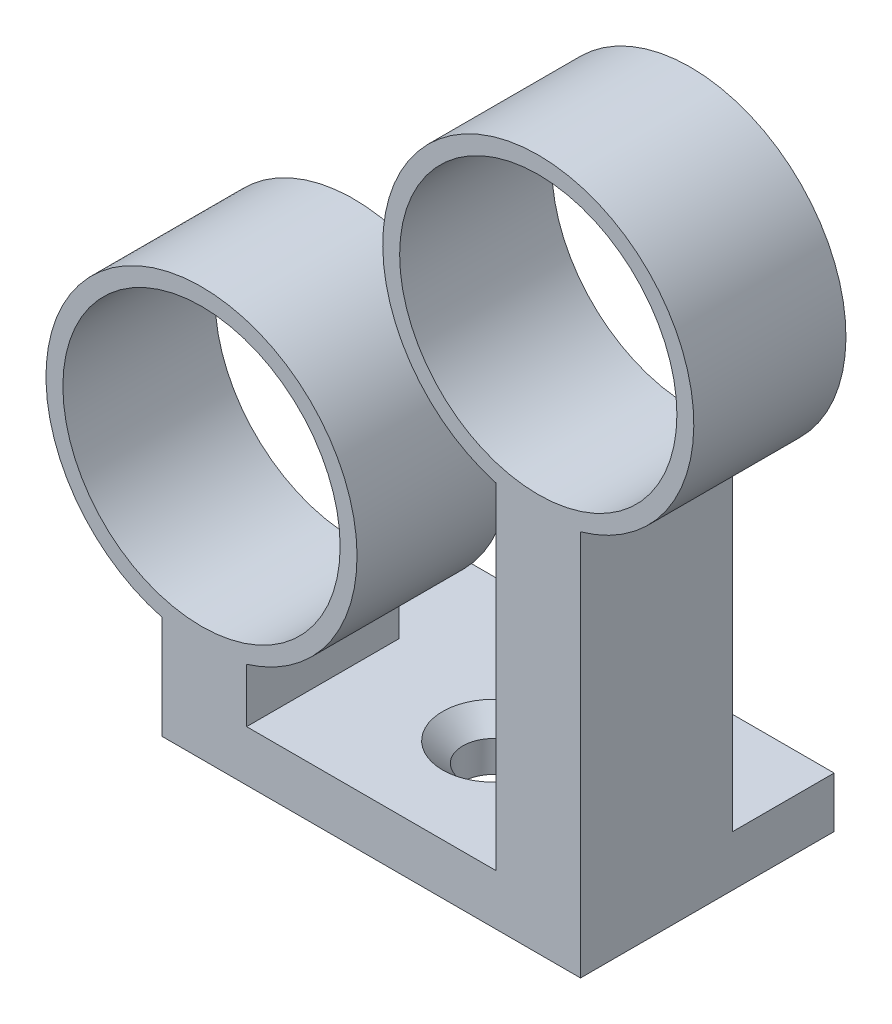
ISO-10303-21;
HEADER;
FILE_DESCRIPTION(('STEP AP214'),'2;1');
FILE_NAME('part.step','',(''),(''),'','','');
FILE_SCHEMA(('AUTOMOTIVE_DESIGN { 1 0 10303 214 1 1 1 1 }'));
ENDSEC;
DATA;
#1=APPLICATION_CONTEXT('core data for automotive mechanical design processes');
#2=APPLICATION_PROTOCOL_DEFINITION('international standard','automotive_design',2000,#1);
#3=PRODUCT_CONTEXT('',#1,'mechanical');
#4=PRODUCT('Part','Part','',(#3));
#5=PRODUCT_RELATED_PRODUCT_CATEGORY('part','',(#4));
#6=PRODUCT_DEFINITION_FORMATION('','',#4);
#7=PRODUCT_DEFINITION_CONTEXT('part definition',#1,'design');
#8=PRODUCT_DEFINITION('design','',#6,#7);
#9=PRODUCT_DEFINITION_SHAPE('','',#8);
#10=(LENGTH_UNIT() NAMED_UNIT(*) SI_UNIT(.MILLI.,.METRE.));
#11=(NAMED_UNIT(*) PLANE_ANGLE_UNIT() SI_UNIT($,.RADIAN.));
#12=(NAMED_UNIT(*) SI_UNIT($,.STERADIAN.) SOLID_ANGLE_UNIT());
#13=UNCERTAINTY_MEASURE_WITH_UNIT(LENGTH_MEASURE(1.E-05),#10,'distance_accuracy_value','');
#14=(GEOMETRIC_REPRESENTATION_CONTEXT(3) GLOBAL_UNCERTAINTY_ASSIGNED_CONTEXT((#13)) GLOBAL_UNIT_ASSIGNED_CONTEXT((#10,
#11,#12)) REPRESENTATION_CONTEXT('',''));
#15=CARTESIAN_POINT('',(0.,0.,0.));
#16=DIRECTION('',(0.,0.,1.));
#17=DIRECTION('',(1.,0.,0.));
#18=AXIS2_PLACEMENT_3D('',#15,#16,#17);
#19=CARTESIAN_POINT('',(0.,27.8227863170303,0.));
#20=DIRECTION('',(0.,-1.,0.));
#21=DIRECTION('',(0.,0.,-1.));
#22=AXIS2_PLACEMENT_3D('',#19,#20,#21);
#23=PLANE('',#22);
#24=CARTESIAN_POINT('',(13.3121057774666,27.8227863170303,2.42580798512129));
#25=DIRECTION('',(0.,1.,0.));
#26=DIRECTION('',(0.,0.,1.));
#27=AXIS2_PLACEMENT_3D('',#24,#25,#26);
#28=CIRCLE('',#27,3.);
#29=CARTESIAN_POINT('',(13.3121057774666,27.8227863170303,5.42580798512129));
#30=VERTEX_POINT('',#29);
#31=EDGE_CURVE('E272',#30,#30,#28,.T.);
#32=ORIENTED_EDGE('',*,*,#31,.F.);
#33=EDGE_LOOP('',(#32));
#34=FACE_BOUND('',#33,.T.);
#35=DIRECTION('',(-1.,0.,0.));
#36=VECTOR('',#35,1.);
#37=CARTESIAN_POINT('',(0.,27.8227863170303,0.));
#38=LINE('',#37,#36);
#39=CARTESIAN_POINT('',(25.0444504525403,27.8227863170303,0.));
#40=VERTEX_POINT('',#39);
#41=CARTESIAN_POINT('',(20.0444504525403,27.8227863170303,0.));
#42=VERTEX_POINT('',#41);
#43=EDGE_CURVE('E145',#40,#42,#38,.T.);
#44=ORIENTED_EDGE('',*,*,#43,.F.);
#45=DIRECTION('',(0.,0.,1.));
#46=VECTOR('',#45,1.);
#47=CARTESIAN_POINT('',(25.0444504525403,27.8227863170303,9.));
#48=LINE('',#47,#46);
#49=CARTESIAN_POINT('',(25.0444504525403,27.8227863170303,-6.));
#50=VERTEX_POINT('',#49);
#51=EDGE_CURVE('E124',#50,#40,#48,.T.);
#52=ORIENTED_EDGE('',*,*,#51,.F.);
#53=DIRECTION('',(1.,0.,0.));
#54=VECTOR('',#53,1.);
#55=CARTESIAN_POINT('',(0.294979989954665,27.8227863170303,-6.));
#56=LINE('',#55,#54);
#57=CARTESIAN_POINT('',(0.294979989954665,27.8227863170303,-6.));
#58=VERTEX_POINT('',#57);
#59=EDGE_CURVE('E155',#58,#50,#56,.T.);
#60=ORIENTED_EDGE('',*,*,#59,.F.);
#61=DIRECTION('',(0.,0.,-1.));
#62=VECTOR('',#61,1.);
#63=CARTESIAN_POINT('',(0.294979989954665,27.8227863170303,9.));
#64=LINE('',#63,#62);
#65=CARTESIAN_POINT('',(0.294979989954665,27.8227863170303,0.));
#66=VERTEX_POINT('',#65);
#67=EDGE_CURVE('E153',#66,#58,#64,.T.);
#68=ORIENTED_EDGE('',*,*,#67,.F.);
#69=DIRECTION('',(1.,0.,0.));
#70=VECTOR('',#69,1.);
#71=CARTESIAN_POINT('',(2.62521602950088,27.8227863170303,0.));
#72=LINE('',#71,#70);
#73=CARTESIAN_POINT('',(5.29497998995467,27.8227863170303,0.));
#74=VERTEX_POINT('',#73);
#75=EDGE_CURVE('E53',#66,#74,#72,.T.);
#76=ORIENTED_EDGE('',*,*,#75,.T.);
#77=DIRECTION('',(0.,0.,1.));
#78=VECTOR('',#77,1.);
#79=CARTESIAN_POINT('',(5.29497998995467,27.8227863170303,9.));
#80=LINE('',#79,#78);
#81=CARTESIAN_POINT('',(5.29497998995467,27.8227863170303,9.));
#82=VERTEX_POINT('',#81);
#83=EDGE_CURVE('E46',#74,#82,#80,.T.);
#84=ORIENTED_EDGE('',*,*,#83,.T.);
#85=DIRECTION('',(-1.,0.,0.));
#86=VECTOR('',#85,1.);
#87=CARTESIAN_POINT('',(0.294979989954665,27.8227863170303,9.));
#88=LINE('',#87,#86);
#89=CARTESIAN_POINT('',(20.0444504525403,27.8227863170303,9.));
#90=VERTEX_POINT('',#89);
#91=EDGE_CURVE('E61',#90,#82,#88,.T.);
#92=ORIENTED_EDGE('',*,*,#91,.F.);
#93=DIRECTION('',(0.,0.,1.));
#94=VECTOR('',#93,1.);
#95=CARTESIAN_POINT('',(20.0444504525403,27.8227863170303,0.));
#96=LINE('',#95,#94);
#97=EDGE_CURVE('E11',#42,#90,#96,.T.);
#98=ORIENTED_EDGE('',*,*,#97,.F.);
#99=EDGE_LOOP('',(#44,#52,#60,#68,#76,#84,#92,#98));
#100=FACE_BOUND('',#99,.T.);
#101=ADVANCED_FACE('F37',(#34,#100),#23,.F.);
#102=CARTESIAN_POINT('',(2.62521602950088,39.8227863170303,0.));
#103=DIRECTION('',(0.,0.,1.));
#104=DIRECTION('',(1.,0.,0.));
#105=AXIS2_PLACEMENT_3D('',#102,#103,#104);
#106=PLANE('',#105);
#107=CARTESIAN_POINT('',(2.62521602950088,39.8227863170303,0.));
#108=DIRECTION('',(0.,0.,1.));
#109=DIRECTION('',(1.,0.,0.));
#110=AXIS2_PLACEMENT_3D('',#107,#108,#109);
#111=CIRCLE('',#110,8.2);
#112=CARTESIAN_POINT('',(10.8252160295009,39.8227863170303,0.));
#113=VERTEX_POINT('',#112);
#114=EDGE_CURVE('E191',#113,#113,#111,.T.);
#115=ORIENTED_EDGE('',*,*,#114,.T.);
#116=EDGE_LOOP('',(#115));
#117=FACE_BOUND('',#116,.T.);
#118=ORIENTED_EDGE('',*,*,#75,.F.);
#119=DIRECTION('',(0.,-1.,0.));
#120=VECTOR('',#119,1.);
#121=CARTESIAN_POINT('',(0.294979989954665,24.8227863170303,0.));
#122=LINE('',#121,#120);
#123=CARTESIAN_POINT('',(0.294979989954665,30.9227863170303,0.));
#124=VERTEX_POINT('',#123);
#125=EDGE_CURVE('E173',#124,#66,#122,.T.);
#126=ORIENTED_EDGE('',*,*,#125,.F.);
#127=CARTESIAN_POINT('',(2.62521602950088,39.8227863170303,0.));
#128=DIRECTION('',(0.,0.,1.));
#129=DIRECTION('',(1.,0.,0.));
#130=AXIS2_PLACEMENT_3D('',#127,#128,#129);
#131=CIRCLE('',#130,9.2);
#132=CARTESIAN_POINT('',(5.29497998995467,31.0186758909019,0.));
#133=VERTEX_POINT('',#132);
#134=EDGE_CURVE('E195',#133,#124,#131,.T.);
#135=ORIENTED_EDGE('',*,*,#134,.F.);
#136=DIRECTION('',(0.,1.,0.));
#137=VECTOR('',#136,1.);
#138=CARTESIAN_POINT('',(5.29497998995467,24.8227863170303,0.));
#139=LINE('',#138,#137);
#140=EDGE_CURVE('E177',#74,#133,#139,.T.);
#141=ORIENTED_EDGE('',*,*,#140,.F.);
#142=EDGE_LOOP('',(#118,#126,#135,#141));
#143=FACE_BOUND('',#142,.T.);
#144=ADVANCED_FACE('F210',(#117,#143),#106,.F.);
#145=CARTESIAN_POINT('',(5.29497998995467,24.8227863170303,9.));
#146=DIRECTION('',(-1.,0.,0.));
#147=DIRECTION('',(0.,0.,1.));
#148=AXIS2_PLACEMENT_3D('',#145,#146,#147);
#149=PLANE('',#148);
#150=ORIENTED_EDGE('',*,*,#83,.F.);
#151=ORIENTED_EDGE('',*,*,#140,.T.);
#152=DIRECTION('',(0.,0.,-1.));
#153=VECTOR('',#152,1.);
#154=CARTESIAN_POINT('',(5.29497998995467,31.0186758909019,9.));
#155=LINE('',#154,#153);
#156=CARTESIAN_POINT('',(5.29497998995467,31.0186758909019,9.));
#157=VERTEX_POINT('',#156);
#158=EDGE_CURVE('E186',#157,#133,#155,.T.);
#159=ORIENTED_EDGE('',*,*,#158,.F.);
#160=DIRECTION('',(0.,1.,0.));
#161=VECTOR('',#160,1.);
#162=CARTESIAN_POINT('',(5.29497998995467,24.8227863170303,9.));
#163=LINE('',#162,#161);
#164=EDGE_CURVE('E179',#82,#157,#163,.T.);
#165=ORIENTED_EDGE('',*,*,#164,.F.);
#166=EDGE_LOOP('',(#150,#151,#159,#165));
#167=FACE_BOUND('',#166,.T.);
#168=ADVANCED_FACE('F207',(#167),#149,.F.);
#169=CARTESIAN_POINT('',(2.62521602950088,39.8227863170303,9.));
#170=DIRECTION('',(0.,0.,-1.));
#171=DIRECTION('',(-1.,0.,0.));
#172=AXIS2_PLACEMENT_3D('',#169,#170,#171);
#173=CYLINDRICAL_SURFACE('',#172,9.2);
#174=DIRECTION('',(0.,0.,-1.));
#175=VECTOR('',#174,1.);
#176=CARTESIAN_POINT('',(0.294979989954665,30.9227863170303,9.));
#177=LINE('',#176,#175);
#178=CARTESIAN_POINT('',(0.294979989954665,30.9227863170303,9.));
#179=VERTEX_POINT('',#178);
#180=EDGE_CURVE('E181',#179,#124,#177,.T.);
#181=ORIENTED_EDGE('',*,*,#180,.F.);
#182=CARTESIAN_POINT('',(2.62521602950088,39.8227863170303,9.));
#183=DIRECTION('',(0.,0.,1.));
#184=DIRECTION('',(1.,0.,0.));
#185=AXIS2_PLACEMENT_3D('',#182,#183,#184);
#186=CIRCLE('',#185,9.2);
#187=EDGE_CURVE('E198',#157,#179,#186,.T.);
#188=ORIENTED_EDGE('',*,*,#187,.F.);
#189=ORIENTED_EDGE('',*,*,#158,.T.);
#190=ORIENTED_EDGE('',*,*,#134,.T.);
#191=EDGE_LOOP('',(#181,#188,#189,#190));
#192=FACE_BOUND('',#191,.T.);
#193=ADVANCED_FACE('F39',(#192),#173,.T.);
#194=CARTESIAN_POINT('',(2.62521602950088,39.8227863170303,9.));
#195=DIRECTION('',(0.,0.,1.));
#196=DIRECTION('',(1.,0.,0.));
#197=AXIS2_PLACEMENT_3D('',#194,#195,#196);
#198=PLANE('',#197);
#199=DIRECTION('',(0.,-1.,0.));
#200=VECTOR('',#199,1.);
#201=CARTESIAN_POINT('',(20.0444504525403,47.7227863170303,9.));
#202=LINE('',#201,#200);
#203=CARTESIAN_POINT('',(20.0444504525403,47.6789735790061,9.));
#204=VERTEX_POINT('',#203);
#205=EDGE_CURVE('E128',#204,#90,#202,.T.);
#206=ORIENTED_EDGE('',*,*,#205,.T.);
#207=ORIENTED_EDGE('',*,*,#91,.T.);
#208=ORIENTED_EDGE('',*,*,#164,.T.);
#209=ORIENTED_EDGE('',*,*,#187,.T.);
#210=DIRECTION('',(0.,-1.,0.));
#211=VECTOR('',#210,1.);
#212=CARTESIAN_POINT('',(0.294979989954665,24.8227863170303,9.));
#213=LINE('',#212,#211);
#214=CARTESIAN_POINT('',(0.294979989954665,24.8227863170303,9.));
#215=VERTEX_POINT('',#214);
#216=EDGE_CURVE('E174',#179,#215,#213,.T.);
#217=ORIENTED_EDGE('',*,*,#216,.T.);
#218=DIRECTION('',(1.,0.,0.));
#219=VECTOR('',#218,1.);
#220=CARTESIAN_POINT('',(0.294979989954665,24.8227863170303,9.));
#221=LINE('',#220,#219);
#222=CARTESIAN_POINT('',(25.0444504525403,24.8227863170303,9.));
#223=VERTEX_POINT('',#222);
#224=EDGE_CURVE('E176',#215,#223,#221,.T.);
#225=ORIENTED_EDGE('',*,*,#224,.T.);
#226=DIRECTION('',(0.,-1.,0.));
#227=VECTOR('',#226,1.);
#228=CARTESIAN_POINT('',(25.0444504525403,27.8227863170303,9.));
#229=LINE('',#228,#227);
#230=CARTESIAN_POINT('',(25.0444504525403,47.6789735790061,9.));
#231=VERTEX_POINT('',#230);
#232=EDGE_CURVE('E166',#231,#223,#229,.T.);
#233=ORIENTED_EDGE('',*,*,#232,.F.);
#234=CARTESIAN_POINT('',(22.5444504525403,56.5327863170303,9.));
#235=DIRECTION('',(0.,0.,1.));
#236=DIRECTION('',(1.,0.,0.));
#237=AXIS2_PLACEMENT_3D('',#234,#235,#236);
#238=CIRCLE('',#237,9.2);
#239=EDGE_CURVE('E137',#231,#204,#238,.T.);
#240=ORIENTED_EDGE('',*,*,#239,.T.);
#241=EDGE_LOOP('',(#206,#207,#208,#209,#217,#225,#233,#240));
#242=FACE_BOUND('',#241,.T.);
#243=CARTESIAN_POINT('',(22.5444504525403,56.5327863170303,9.));
#244=DIRECTION('',(0.,0.,1.));
#245=DIRECTION('',(1.,0.,0.));
#246=AXIS2_PLACEMENT_3D('',#243,#244,#245);
#247=CIRCLE('',#246,8.2);
#248=CARTESIAN_POINT('',(30.7444504525403,56.5327863170303,9.));
#249=VERTEX_POINT('',#248);
#250=EDGE_CURVE('E136',#249,#249,#247,.T.);
#251=ORIENTED_EDGE('',*,*,#250,.F.);
#252=EDGE_LOOP('',(#251));
#253=FACE_BOUND('',#252,.T.);
#254=CARTESIAN_POINT('',(2.62521602950088,39.8227863170303,9.));
#255=DIRECTION('',(0.,0.,1.));
#256=DIRECTION('',(1.,0.,0.));
#257=AXIS2_PLACEMENT_3D('',#254,#255,#256);
#258=CIRCLE('',#257,8.2);
#259=CARTESIAN_POINT('',(10.8252160295009,39.8227863170303,9.));
#260=VERTEX_POINT('',#259);
#261=EDGE_CURVE('E192',#260,#260,#258,.T.);
#262=ORIENTED_EDGE('',*,*,#261,.F.);
#263=EDGE_LOOP('',(#262));
#264=FACE_BOUND('',#263,.T.);
#265=ADVANCED_FACE('F214',(#242,#253,#264),#198,.T.);
#266=CARTESIAN_POINT('',(2.62521602950088,39.8227863170303,9.));
#267=DIRECTION('',(0.,0.,-1.));
#268=DIRECTION('',(-1.,0.,0.));
#269=AXIS2_PLACEMENT_3D('',#266,#267,#268);
#270=CYLINDRICAL_SURFACE('',#269,8.2);
#271=ORIENTED_EDGE('',*,*,#261,.T.);
#272=EDGE_LOOP('',(#271));
#273=FACE_BOUND('',#272,.T.);
#274=ORIENTED_EDGE('',*,*,#114,.F.);
#275=EDGE_LOOP('',(#274));
#276=FACE_BOUND('',#275,.T.);
#277=ADVANCED_FACE('F287',(#273,#276),#270,.F.);
#278=CARTESIAN_POINT('',(0.294979989954665,24.8227863170303,9.));
#279=DIRECTION('',(1.,0.,0.));
#280=DIRECTION('',(0.,0.,-1.));
#281=AXIS2_PLACEMENT_3D('',#278,#279,#280);
#282=PLANE('',#281);
#283=DIRECTION('',(0.,0.,-1.));
#284=VECTOR('',#283,1.);
#285=CARTESIAN_POINT('',(0.294979989954665,24.8227863170303,9.));
#286=LINE('',#285,#284);
#287=CARTESIAN_POINT('',(0.294979989954665,24.8227863170303,-6.));
#288=VERTEX_POINT('',#287);
#289=EDGE_CURVE('E189',#215,#288,#286,.T.);
#290=ORIENTED_EDGE('',*,*,#289,.F.);
#291=ORIENTED_EDGE('',*,*,#216,.F.);
#292=ORIENTED_EDGE('',*,*,#180,.T.);
#293=ORIENTED_EDGE('',*,*,#125,.T.);
#294=ORIENTED_EDGE('',*,*,#67,.T.);
#295=DIRECTION('',(0.,-1.,0.));
#296=VECTOR('',#295,1.);
#297=CARTESIAN_POINT('',(0.294979989954665,27.8227863170303,-6.));
#298=LINE('',#297,#296);
#299=EDGE_CURVE('E161',#58,#288,#298,.T.);
#300=ORIENTED_EDGE('',*,*,#299,.T.);
#301=EDGE_LOOP('',(#290,#291,#292,#293,#294,#300));
#302=FACE_BOUND('',#301,.T.);
#303=ADVANCED_FACE('F219',(#302),#282,.F.);
#304=CARTESIAN_POINT('',(0.294979989954665,24.8227863170303,9.));
#305=DIRECTION('',(0.,1.,0.));
#306=DIRECTION('',(-1.,0.,0.));
#307=AXIS2_PLACEMENT_3D('',#304,#305,#306);
#308=PLANE('',#307);
#309=CARTESIAN_POINT('',(13.3121057774666,24.8227863170303,2.42580798512129));
#310=DIRECTION('',(0.,1.,0.));
#311=DIRECTION('',(-1.,0.,0.));
#312=AXIS2_PLACEMENT_3D('',#309,#310,#311);
#313=CIRCLE('',#312,1.79999999999999);
#314=CARTESIAN_POINT('',(11.5121057774666,24.8227863170303,2.42580798512129));
#315=VERTEX_POINT('',#314);
#316=EDGE_CURVE('E41',#315,#315,#313,.T.);
#317=ORIENTED_EDGE('',*,*,#316,.T.);
#318=EDGE_LOOP('',(#317));
#319=FACE_BOUND('',#318,.T.);
#320=DIRECTION('',(0.,0.,1.));
#321=VECTOR('',#320,1.);
#322=CARTESIAN_POINT('',(25.0444504525403,24.8227863170303,9.));
#323=LINE('',#322,#321);
#324=CARTESIAN_POINT('',(25.0444504525403,24.8227863170303,-6.));
#325=VERTEX_POINT('',#324);
#326=EDGE_CURVE('E156',#325,#223,#323,.T.);
#327=ORIENTED_EDGE('',*,*,#326,.T.);
#328=ORIENTED_EDGE('',*,*,#224,.F.);
#329=ORIENTED_EDGE('',*,*,#289,.T.);
#330=DIRECTION('',(1.,0.,0.));
#331=VECTOR('',#330,1.);
#332=CARTESIAN_POINT('',(0.294979989954665,24.8227863170303,-6.));
#333=LINE('',#332,#331);
#334=EDGE_CURVE('E152',#288,#325,#333,.T.);
#335=ORIENTED_EDGE('',*,*,#334,.T.);
#336=EDGE_LOOP('',(#327,#328,#329,#335));
#337=FACE_BOUND('',#336,.T.);
#338=ADVANCED_FACE('F223',(#319,#337),#308,.F.);
#339=CARTESIAN_POINT('',(25.0444504525403,27.8227863170303,9.));
#340=DIRECTION('',(1.,0.,0.));
#341=DIRECTION('',(0.,0.,-1.));
#342=AXIS2_PLACEMENT_3D('',#339,#340,#341);
#343=PLANE('',#342);
#344=ORIENTED_EDGE('',*,*,#232,.T.);
#345=ORIENTED_EDGE('',*,*,#326,.F.);
#346=DIRECTION('',(0.,-1.,0.));
#347=VECTOR('',#346,1.);
#348=CARTESIAN_POINT('',(25.0444504525403,27.8227863170303,-6.));
#349=LINE('',#348,#347);
#350=EDGE_CURVE('E168',#50,#325,#349,.T.);
#351=ORIENTED_EDGE('',*,*,#350,.F.);
#352=ORIENTED_EDGE('',*,*,#51,.T.);
#353=DIRECTION('',(0.,1.,0.));
#354=VECTOR('',#353,1.);
#355=CARTESIAN_POINT('',(25.0444504525403,47.7227863170303,0.));
#356=LINE('',#355,#354);
#357=CARTESIAN_POINT('',(25.0444504525403,47.6789735790061,0.));
#358=VERTEX_POINT('',#357);
#359=EDGE_CURVE('E117',#40,#358,#356,.T.);
#360=ORIENTED_EDGE('',*,*,#359,.T.);
#361=DIRECTION('',(0.,0.,-1.));
#362=VECTOR('',#361,1.);
#363=CARTESIAN_POINT('',(25.0444504525403,47.6789735790061,9.));
#364=LINE('',#363,#362);
#365=EDGE_CURVE('E122',#358,#231,#364,.F.);
#366=ORIENTED_EDGE('',*,*,#365,.T.);
#367=EDGE_LOOP('',(#344,#345,#351,#352,#360,#366));
#368=FACE_BOUND('',#367,.T.);
#369=ADVANCED_FACE('F120',(#368),#343,.T.);
#370=CARTESIAN_POINT('',(0.294979989954665,27.8227863170303,-6.));
#371=DIRECTION('',(0.,0.,-1.));
#372=DIRECTION('',(-1.,0.,0.));
#373=AXIS2_PLACEMENT_3D('',#370,#371,#372);
#374=PLANE('',#373);
#375=ORIENTED_EDGE('',*,*,#334,.F.);
#376=ORIENTED_EDGE('',*,*,#299,.F.);
#377=ORIENTED_EDGE('',*,*,#59,.T.);
#378=ORIENTED_EDGE('',*,*,#350,.T.);
#379=EDGE_LOOP('',(#375,#376,#377,#378));
#380=FACE_BOUND('',#379,.T.);
#381=ADVANCED_FACE('F228',(#380),#374,.T.);
#382=CARTESIAN_POINT('',(20.0444504525403,47.7227863170303,9.));
#383=DIRECTION('',(1.,0.,0.));
#384=DIRECTION('',(0.,1.,0.));
#385=AXIS2_PLACEMENT_3D('',#382,#383,#384);
#386=PLANE('',#385);
#387=DIRECTION('',(0.,-1.,0.));
#388=VECTOR('',#387,1.);
#389=CARTESIAN_POINT('',(20.0444504525403,47.7227863170303,0.));
#390=LINE('',#389,#388);
#391=CARTESIAN_POINT('',(20.0444504525403,47.6789735790061,0.));
#392=VERTEX_POINT('',#391);
#393=EDGE_CURVE('E127',#392,#42,#390,.T.);
#394=ORIENTED_EDGE('',*,*,#393,.T.);
#395=ORIENTED_EDGE('',*,*,#97,.T.);
#396=ORIENTED_EDGE('',*,*,#205,.F.);
#397=DIRECTION('',(0.,0.,-1.));
#398=VECTOR('',#397,1.);
#399=CARTESIAN_POINT('',(20.0444504525403,47.6789735790061,9.));
#400=LINE('',#399,#398);
#401=EDGE_CURVE('E142',#204,#392,#400,.T.);
#402=ORIENTED_EDGE('',*,*,#401,.T.);
#403=EDGE_LOOP('',(#394,#395,#396,#402));
#404=FACE_BOUND('',#403,.T.);
#405=ADVANCED_FACE('F230',(#404),#386,.F.);
#406=CARTESIAN_POINT('',(22.5444504525403,56.5327863170303,0.));
#407=DIRECTION('',(0.,0.,1.));
#408=DIRECTION('',(1.,0.,0.));
#409=AXIS2_PLACEMENT_3D('',#406,#407,#408);
#410=PLANE('',#409);
#411=CARTESIAN_POINT('',(22.5444504525403,56.5327863170303,0.));
#412=DIRECTION('',(0.,0.,1.));
#413=DIRECTION('',(1.,0.,0.));
#414=AXIS2_PLACEMENT_3D('',#411,#412,#413);
#415=CIRCLE('',#414,8.2);
#416=CARTESIAN_POINT('',(30.7444504525403,56.5327863170303,0.));
#417=VERTEX_POINT('',#416);
#418=EDGE_CURVE('E143',#417,#417,#415,.T.);
#419=ORIENTED_EDGE('',*,*,#418,.T.);
#420=EDGE_LOOP('',(#419));
#421=FACE_BOUND('',#420,.T.);
#422=ORIENTED_EDGE('',*,*,#359,.F.);
#423=ORIENTED_EDGE('',*,*,#43,.T.);
#424=ORIENTED_EDGE('',*,*,#393,.F.);
#425=CARTESIAN_POINT('',(22.5444504525403,56.5327863170303,0.));
#426=DIRECTION('',(0.,0.,1.));
#427=DIRECTION('',(1.,0.,0.));
#428=AXIS2_PLACEMENT_3D('',#425,#426,#427);
#429=CIRCLE('',#428,9.2);
#430=EDGE_CURVE('E131',#358,#392,#429,.T.);
#431=ORIENTED_EDGE('',*,*,#430,.F.);
#432=EDGE_LOOP('',(#422,#423,#424,#431));
#433=FACE_BOUND('',#432,.T.);
#434=ADVANCED_FACE('F132',(#421,#433),#410,.F.);
#435=CARTESIAN_POINT('',(22.5444504525403,56.5327863170303,9.));
#436=DIRECTION('',(0.,0.,-1.));
#437=DIRECTION('',(-1.,0.,0.));
#438=AXIS2_PLACEMENT_3D('',#435,#436,#437);
#439=CYLINDRICAL_SURFACE('',#438,9.2);
#440=ORIENTED_EDGE('',*,*,#401,.F.);
#441=ORIENTED_EDGE('',*,*,#239,.F.);
#442=ORIENTED_EDGE('',*,*,#365,.F.);
#443=ORIENTED_EDGE('',*,*,#430,.T.);
#444=EDGE_LOOP('',(#440,#441,#442,#443));
#445=FACE_BOUND('',#444,.T.);
#446=ADVANCED_FACE('F140',(#445),#439,.T.);
#447=CARTESIAN_POINT('',(22.5444504525403,56.5327863170303,9.));
#448=DIRECTION('',(0.,0.,-1.));
#449=DIRECTION('',(-1.,0.,0.));
#450=AXIS2_PLACEMENT_3D('',#447,#448,#449);
#451=CYLINDRICAL_SURFACE('',#450,8.2);
#452=ORIENTED_EDGE('',*,*,#250,.T.);
#453=EDGE_LOOP('',(#452));
#454=FACE_BOUND('',#453,.T.);
#455=ORIENTED_EDGE('',*,*,#418,.F.);
#456=EDGE_LOOP('',(#455));
#457=FACE_BOUND('',#456,.T.);
#458=ADVANCED_FACE('F249',(#454,#457),#451,.F.);
#459=CARTESIAN_POINT('',(13.3121057774666,27.8227863170303,2.42580798512129));
#460=DIRECTION('',(0.,1.,0.));
#461=DIRECTION('',(0.,0.,1.));
#462=AXIS2_PLACEMENT_3D('',#459,#460,#461);
#463=CYLINDRICAL_SURFACE('',#462,1.79999999999999);
#464=CARTESIAN_POINT('',(13.3121057774666,26.6639597872618,2.42580798512129));
#465=DIRECTION('',(0.,1.,0.));
#466=DIRECTION('',(0.,0.,1.));
#467=AXIS2_PLACEMENT_3D('',#464,#465,#466);
#468=CIRCLE('',#467,1.8);
#469=CARTESIAN_POINT('',(13.3121057774666,26.6639597872618,4.22580798512129));
#470=VERTEX_POINT('',#469);
#471=EDGE_CURVE('E270',#470,#470,#468,.T.);
#472=ORIENTED_EDGE('',*,*,#471,.T.);
#473=EDGE_LOOP('',(#472));
#474=FACE_BOUND('',#473,.T.);
#475=ORIENTED_EDGE('',*,*,#316,.F.);
#476=EDGE_LOOP('',(#475));
#477=FACE_BOUND('',#476,.T.);
#478=ADVANCED_FACE('F252',(#474,#477),#463,.F.);
#479=CARTESIAN_POINT('',(13.3121057774666,27.8227863170303,2.42580798512129));
#480=DIRECTION('',(0.,1.,0.));
#481=DIRECTION('',(0.,0.,1.));
#482=AXIS2_PLACEMENT_3D('',#479,#480,#481);
#483=CONICAL_SURFACE('',#482,3.,0.802851455917389);
#484=ORIENTED_EDGE('',*,*,#471,.F.);
#485=EDGE_LOOP('',(#484));
#486=FACE_BOUND('',#485,.T.);
#487=ORIENTED_EDGE('',*,*,#31,.T.);
#488=EDGE_LOOP('',(#487));
#489=FACE_BOUND('',#488,.T.);
#490=ADVANCED_FACE('F261',(#486,#489),#483,.F.);
#491=CLOSED_SHELL('',(#101,#144,#168,#193,#265,#277,#303,#338,#369,#381,#405,#434,#446,#458,
#478,#490));
#492=MANIFOLD_SOLID_BREP('B2',#491);
#493=ADVANCED_BREP_SHAPE_REPRESENTATION('',(#18,#492),#14);
#494=SHAPE_DEFINITION_REPRESENTATION(#9,#493);
ENDSEC;
END-ISO-10303-21;
